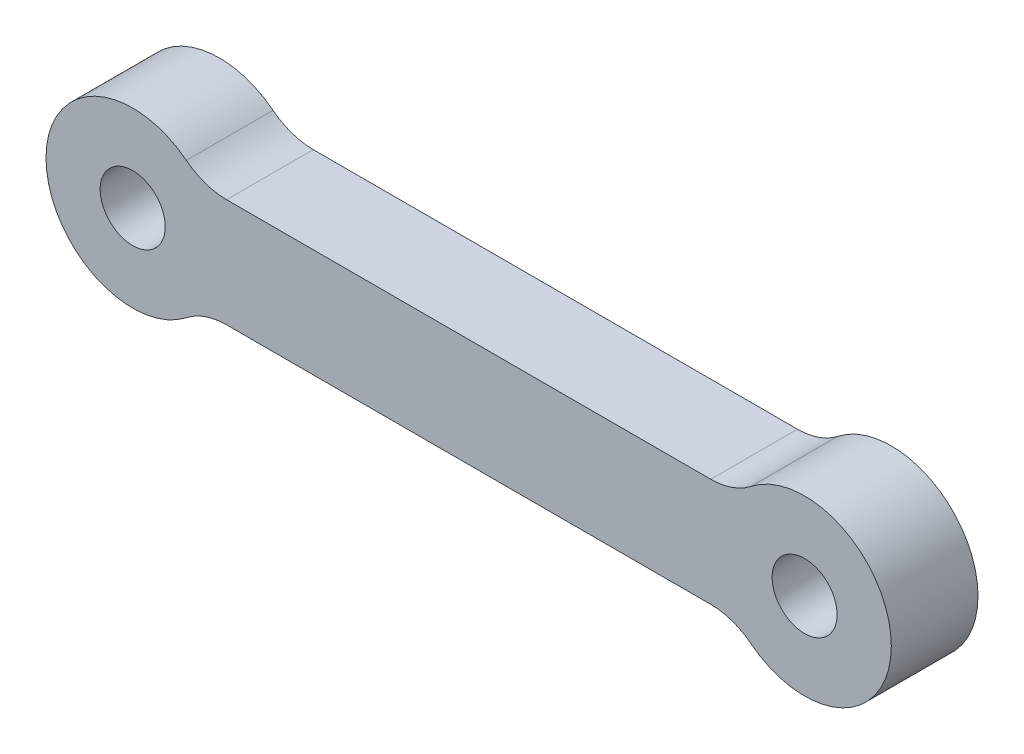
ISO-10303-21;
HEADER;
FILE_DESCRIPTION(('STEP AP214'),'2;1');
FILE_NAME('part.step','',(''),(''),'','','');
FILE_SCHEMA(('AUTOMOTIVE_DESIGN { 1 0 10303 214 1 1 1 1 }'));
ENDSEC;
DATA;
#1=APPLICATION_CONTEXT('core data for automotive mechanical design processes');
#2=APPLICATION_PROTOCOL_DEFINITION('international standard','automotive_design',2000,#1);
#3=PRODUCT_CONTEXT('',#1,'mechanical');
#4=PRODUCT('Part','Part','',(#3));
#5=PRODUCT_RELATED_PRODUCT_CATEGORY('part','',(#4));
#6=PRODUCT_DEFINITION_FORMATION('','',#4);
#7=PRODUCT_DEFINITION_CONTEXT('part definition',#1,'design');
#8=PRODUCT_DEFINITION('design','',#6,#7);
#9=PRODUCT_DEFINITION_SHAPE('','',#8);
#10=(LENGTH_UNIT() NAMED_UNIT(*) SI_UNIT(.MILLI.,.METRE.));
#11=(NAMED_UNIT(*) PLANE_ANGLE_UNIT() SI_UNIT($,.RADIAN.));
#12=(NAMED_UNIT(*) SI_UNIT($,.STERADIAN.) SOLID_ANGLE_UNIT());
#13=UNCERTAINTY_MEASURE_WITH_UNIT(LENGTH_MEASURE(1.E-05),#10,'distance_accuracy_value','');
#14=(GEOMETRIC_REPRESENTATION_CONTEXT(3) GLOBAL_UNCERTAINTY_ASSIGNED_CONTEXT((#13)) GLOBAL_UNIT_ASSIGNED_CONTEXT((#10,
#11,#12)) REPRESENTATION_CONTEXT('',''));
#15=CARTESIAN_POINT('',(0.,0.,0.));
#16=DIRECTION('',(0.,0.,1.));
#17=DIRECTION('',(1.,0.,0.));
#18=AXIS2_PLACEMENT_3D('',#15,#16,#17);
#19=CARTESIAN_POINT('',(11.1698729810778,-5.5,4.));
#20=DIRECTION('',(0.,0.,-1.));
#21=DIRECTION('',(-1.,0.,0.));
#22=AXIS2_PLACEMENT_3D('',#19,#20,#21);
#23=PLANE('',#22);
#24=CARTESIAN_POINT('',(11.1698729810778,-5.5,4.));
#25=DIRECTION('',(0.,0.,-1.));
#26=DIRECTION('',(-1.,0.,0.));
#27=AXIS2_PLACEMENT_3D('',#24,#25,#26);
#28=CIRCLE('',#27,3.);
#29=CARTESIAN_POINT('',(11.1698729810778,-2.5,4.));
#30=VERTEX_POINT('',#29);
#31=CARTESIAN_POINT('',(13.025641703473,-3.14285714285715,4.));
#32=VERTEX_POINT('',#31);
#33=EDGE_CURVE('E148',#30,#32,#28,.T.);
#34=ORIENTED_EDGE('',*,*,#33,.T.);
#35=CARTESIAN_POINT('',(15.5,0.,4.));
#36=DIRECTION('',(0.,0.,1.));
#37=DIRECTION('',(-1.,0.,0.));
#38=AXIS2_PLACEMENT_3D('',#35,#36,#37);
#39=CIRCLE('',#38,4.00000000000003);
#40=CARTESIAN_POINT('',(13.025641703473,3.14285714285715,4.));
#41=VERTEX_POINT('',#40);
#42=EDGE_CURVE('E96',#32,#41,#39,.T.);
#43=ORIENTED_EDGE('',*,*,#42,.T.);
#44=CARTESIAN_POINT('',(11.1698729810778,5.5,4.));
#45=DIRECTION('',(0.,0.,-1.));
#46=DIRECTION('',(-1.,0.,0.));
#47=AXIS2_PLACEMENT_3D('',#44,#45,#46);
#48=CIRCLE('',#47,3.);
#49=CARTESIAN_POINT('',(11.1698729810778,2.5,4.));
#50=VERTEX_POINT('',#49);
#51=EDGE_CURVE('E163',#41,#50,#48,.T.);
#52=ORIENTED_EDGE('',*,*,#51,.T.);
#53=DIRECTION('',(-1.,0.,0.));
#54=VECTOR('',#53,1.);
#55=CARTESIAN_POINT('',(11.1698729810778,2.5,4.));
#56=LINE('',#55,#54);
#57=CARTESIAN_POINT('',(-11.1698729810778,2.5,4.));
#58=VERTEX_POINT('',#57);
#59=EDGE_CURVE('E176',#50,#58,#56,.T.);
#60=ORIENTED_EDGE('',*,*,#59,.T.);
#61=CARTESIAN_POINT('',(-11.1698729810778,5.5,4.));
#62=DIRECTION('',(0.,0.,-1.));
#63=DIRECTION('',(-1.,0.,0.));
#64=AXIS2_PLACEMENT_3D('',#61,#62,#63);
#65=CIRCLE('',#64,3.);
#66=CARTESIAN_POINT('',(-13.025641703473,3.14285714285715,4.));
#67=VERTEX_POINT('',#66);
#68=EDGE_CURVE('E115',#58,#67,#65,.T.);
#69=ORIENTED_EDGE('',*,*,#68,.T.);
#70=CARTESIAN_POINT('',(-15.5,0.,4.));
#71=DIRECTION('',(0.,0.,1.));
#72=DIRECTION('',(1.,0.,0.));
#73=AXIS2_PLACEMENT_3D('',#70,#71,#72);
#74=CIRCLE('',#73,4.00000000000003);
#75=CARTESIAN_POINT('',(-13.025641703473,-3.14285714285715,4.));
#76=VERTEX_POINT('',#75);
#77=EDGE_CURVE('E109',#67,#76,#74,.T.);
#78=ORIENTED_EDGE('',*,*,#77,.T.);
#79=CARTESIAN_POINT('',(-11.1698729810778,-5.5,4.));
#80=DIRECTION('',(0.,0.,-1.));
#81=DIRECTION('',(1.,0.,0.));
#82=AXIS2_PLACEMENT_3D('',#79,#80,#81);
#83=CIRCLE('',#82,3.);
#84=CARTESIAN_POINT('',(-11.1698729810778,-2.5,4.));
#85=VERTEX_POINT('',#84);
#86=EDGE_CURVE('E113',#76,#85,#83,.T.);
#87=ORIENTED_EDGE('',*,*,#86,.T.);
#88=DIRECTION('',(1.,0.,0.));
#89=VECTOR('',#88,1.);
#90=CARTESIAN_POINT('',(11.1698729810778,-2.5,4.));
#91=LINE('',#90,#89);
#92=EDGE_CURVE('E53',#85,#30,#91,.T.);
#93=ORIENTED_EDGE('',*,*,#92,.T.);
#94=EDGE_LOOP('',(#34,#43,#52,#60,#69,#78,#87,#93));
#95=FACE_BOUND('',#94,.T.);
#96=CARTESIAN_POINT('',(-15.5,0.,4.));
#97=DIRECTION('',(0.,0.,1.));
#98=DIRECTION('',(1.,0.,0.));
#99=AXIS2_PLACEMENT_3D('',#96,#97,#98);
#100=CIRCLE('',#99,1.5);
#101=CARTESIAN_POINT('',(-14.,0.,4.));
#102=VERTEX_POINT('',#101);
#103=EDGE_CURVE('E137',#102,#102,#100,.T.);
#104=ORIENTED_EDGE('',*,*,#103,.F.);
#105=EDGE_LOOP('',(#104));
#106=FACE_BOUND('',#105,.T.);
#107=CARTESIAN_POINT('',(15.5,0.,4.));
#108=DIRECTION('',(0.,0.,1.));
#109=DIRECTION('',(-1.,0.,0.));
#110=AXIS2_PLACEMENT_3D('',#107,#108,#109);
#111=CIRCLE('',#110,1.5);
#112=CARTESIAN_POINT('',(14.,0.,4.));
#113=VERTEX_POINT('',#112);
#114=EDGE_CURVE('E185',#113,#113,#111,.T.);
#115=ORIENTED_EDGE('',*,*,#114,.F.);
#116=EDGE_LOOP('',(#115));
#117=FACE_BOUND('',#116,.T.);
#118=ADVANCED_FACE('F36',(#95,#106,#117),#23,.F.);
#119=CARTESIAN_POINT('',(11.1698729810778,-5.5,0.));
#120=DIRECTION('',(0.,0.,-1.));
#121=DIRECTION('',(-1.,0.,0.));
#122=AXIS2_PLACEMENT_3D('',#119,#120,#121);
#123=PLANE('',#122);
#124=CARTESIAN_POINT('',(-15.5,0.,0.));
#125=DIRECTION('',(0.,0.,1.));
#126=DIRECTION('',(1.,0.,0.));
#127=AXIS2_PLACEMENT_3D('',#124,#125,#126);
#128=CIRCLE('',#127,1.5);
#129=CARTESIAN_POINT('',(-14.,0.,0.));
#130=VERTEX_POINT('',#129);
#131=EDGE_CURVE('E182',#130,#130,#128,.T.);
#132=ORIENTED_EDGE('',*,*,#131,.T.);
#133=EDGE_LOOP('',(#132));
#134=FACE_BOUND('',#133,.T.);
#135=CARTESIAN_POINT('',(11.1698729810778,-5.5,0.));
#136=DIRECTION('',(0.,0.,-1.));
#137=DIRECTION('',(-1.,0.,0.));
#138=AXIS2_PLACEMENT_3D('',#135,#136,#137);
#139=CIRCLE('',#138,3.);
#140=CARTESIAN_POINT('',(11.1698729810778,-2.5,0.));
#141=VERTEX_POINT('',#140);
#142=CARTESIAN_POINT('',(13.025641703473,-3.14285714285715,0.));
#143=VERTEX_POINT('',#142);
#144=EDGE_CURVE('E133',#141,#143,#139,.T.);
#145=ORIENTED_EDGE('',*,*,#144,.F.);
#146=DIRECTION('',(1.,0.,0.));
#147=VECTOR('',#146,1.);
#148=CARTESIAN_POINT('',(11.1698729810778,-2.5,0.));
#149=LINE('',#148,#147);
#150=CARTESIAN_POINT('',(-11.1698729810778,-2.5,0.));
#151=VERTEX_POINT('',#150);
#152=EDGE_CURVE('E88',#151,#141,#149,.T.);
#153=ORIENTED_EDGE('',*,*,#152,.F.);
#154=CARTESIAN_POINT('',(-11.1698729810778,-5.5,0.));
#155=DIRECTION('',(0.,0.,-1.));
#156=DIRECTION('',(1.,0.,0.));
#157=AXIS2_PLACEMENT_3D('',#154,#155,#156);
#158=CIRCLE('',#157,3.);
#159=CARTESIAN_POINT('',(-13.025641703473,-3.14285714285715,0.));
#160=VERTEX_POINT('',#159);
#161=EDGE_CURVE('E82',#160,#151,#158,.T.);
#162=ORIENTED_EDGE('',*,*,#161,.F.);
#163=CARTESIAN_POINT('',(-15.5,0.,0.));
#164=DIRECTION('',(0.,0.,1.));
#165=DIRECTION('',(1.,0.,0.));
#166=AXIS2_PLACEMENT_3D('',#163,#164,#165);
#167=CIRCLE('',#166,4.00000000000003);
#168=CARTESIAN_POINT('',(-13.025641703473,3.14285714285715,0.));
#169=VERTEX_POINT('',#168);
#170=EDGE_CURVE('E123',#169,#160,#167,.T.);
#171=ORIENTED_EDGE('',*,*,#170,.F.);
#172=CARTESIAN_POINT('',(-11.1698729810778,5.5,0.));
#173=DIRECTION('',(0.,0.,-1.));
#174=DIRECTION('',(-1.,0.,0.));
#175=AXIS2_PLACEMENT_3D('',#172,#173,#174);
#176=CIRCLE('',#175,3.);
#177=CARTESIAN_POINT('',(-11.1698729810778,2.5,0.));
#178=VERTEX_POINT('',#177);
#179=EDGE_CURVE('E143',#178,#169,#176,.T.);
#180=ORIENTED_EDGE('',*,*,#179,.F.);
#181=DIRECTION('',(-1.,0.,0.));
#182=VECTOR('',#181,1.);
#183=CARTESIAN_POINT('',(11.1698729810778,2.5,0.));
#184=LINE('',#183,#182);
#185=CARTESIAN_POINT('',(11.1698729810778,2.5,0.));
#186=VERTEX_POINT('',#185);
#187=EDGE_CURVE('E141',#186,#178,#184,.T.);
#188=ORIENTED_EDGE('',*,*,#187,.F.);
#189=CARTESIAN_POINT('',(11.1698729810778,5.5,0.));
#190=DIRECTION('',(0.,0.,-1.));
#191=DIRECTION('',(-1.,0.,0.));
#192=AXIS2_PLACEMENT_3D('',#189,#190,#191);
#193=CIRCLE('',#192,3.);
#194=CARTESIAN_POINT('',(13.025641703473,3.14285714285715,0.));
#195=VERTEX_POINT('',#194);
#196=EDGE_CURVE('E139',#195,#186,#193,.T.);
#197=ORIENTED_EDGE('',*,*,#196,.F.);
#198=CARTESIAN_POINT('',(15.5,0.,0.));
#199=DIRECTION('',(0.,0.,1.));
#200=DIRECTION('',(-1.,0.,0.));
#201=AXIS2_PLACEMENT_3D('',#198,#199,#200);
#202=CIRCLE('',#201,4.00000000000003);
#203=EDGE_CURVE('E136',#143,#195,#202,.T.);
#204=ORIENTED_EDGE('',*,*,#203,.F.);
#205=EDGE_LOOP('',(#145,#153,#162,#171,#180,#188,#197,#204));
#206=FACE_BOUND('',#205,.T.);
#207=CARTESIAN_POINT('',(15.5,0.,0.));
#208=DIRECTION('',(0.,0.,1.));
#209=DIRECTION('',(-1.,0.,0.));
#210=AXIS2_PLACEMENT_3D('',#207,#208,#209);
#211=CIRCLE('',#210,1.5);
#212=CARTESIAN_POINT('',(14.,0.,0.));
#213=VERTEX_POINT('',#212);
#214=EDGE_CURVE('E188',#213,#213,#211,.T.);
#215=ORIENTED_EDGE('',*,*,#214,.T.);
#216=EDGE_LOOP('',(#215));
#217=FACE_BOUND('',#216,.T.);
#218=ADVANCED_FACE('F167',(#134,#206,#217),#123,.T.);
#219=CARTESIAN_POINT('',(11.1698729810778,-5.5,4.));
#220=DIRECTION('',(0.,0.,-1.));
#221=DIRECTION('',(-1.,0.,0.));
#222=AXIS2_PLACEMENT_3D('',#219,#220,#221);
#223=CYLINDRICAL_SURFACE('',#222,3.);
#224=ORIENTED_EDGE('',*,*,#144,.T.);
#225=DIRECTION('',(0.,0.,-1.));
#226=VECTOR('',#225,1.);
#227=CARTESIAN_POINT('',(13.025641703473,-3.14285714285715,4.));
#228=LINE('',#227,#226);
#229=EDGE_CURVE('E11',#32,#143,#228,.T.);
#230=ORIENTED_EDGE('',*,*,#229,.F.);
#231=ORIENTED_EDGE('',*,*,#33,.F.);
#232=DIRECTION('',(0.,0.,-1.));
#233=VECTOR('',#232,1.);
#234=CARTESIAN_POINT('',(11.1698729810778,-2.5,4.));
#235=LINE('',#234,#233);
#236=EDGE_CURVE('E129',#30,#141,#235,.T.);
#237=ORIENTED_EDGE('',*,*,#236,.T.);
#238=EDGE_LOOP('',(#224,#230,#231,#237));
#239=FACE_BOUND('',#238,.T.);
#240=ADVANCED_FACE('F38',(#239),#223,.F.);
#241=CARTESIAN_POINT('',(15.5,0.,4.));
#242=DIRECTION('',(0.,0.,-1.));
#243=DIRECTION('',(-1.,0.,0.));
#244=AXIS2_PLACEMENT_3D('',#241,#242,#243);
#245=CYLINDRICAL_SURFACE('',#244,4.00000000000003);
#246=ORIENTED_EDGE('',*,*,#203,.T.);
#247=DIRECTION('',(0.,0.,-1.));
#248=VECTOR('',#247,1.);
#249=CARTESIAN_POINT('',(13.025641703473,3.14285714285715,4.));
#250=LINE('',#249,#248);
#251=EDGE_CURVE('E45',#41,#195,#250,.T.);
#252=ORIENTED_EDGE('',*,*,#251,.F.);
#253=ORIENTED_EDGE('',*,*,#42,.F.);
#254=ORIENTED_EDGE('',*,*,#229,.T.);
#255=EDGE_LOOP('',(#246,#252,#253,#254));
#256=FACE_BOUND('',#255,.T.);
#257=ADVANCED_FACE('F220',(#256),#245,.T.);
#258=CARTESIAN_POINT('',(11.1698729810778,5.5,4.));
#259=DIRECTION('',(0.,0.,-1.));
#260=DIRECTION('',(-1.,0.,0.));
#261=AXIS2_PLACEMENT_3D('',#258,#259,#260);
#262=CYLINDRICAL_SURFACE('',#261,3.);
#263=ORIENTED_EDGE('',*,*,#196,.T.);
#264=DIRECTION('',(0.,0.,-1.));
#265=VECTOR('',#264,1.);
#266=CARTESIAN_POINT('',(11.1698729810778,2.5,4.));
#267=LINE('',#266,#265);
#268=EDGE_CURVE('E155',#50,#186,#267,.T.);
#269=ORIENTED_EDGE('',*,*,#268,.F.);
#270=ORIENTED_EDGE('',*,*,#51,.F.);
#271=ORIENTED_EDGE('',*,*,#251,.T.);
#272=EDGE_LOOP('',(#263,#269,#270,#271));
#273=FACE_BOUND('',#272,.T.);
#274=ADVANCED_FACE('F161',(#273),#262,.F.);
#275=CARTESIAN_POINT('',(11.1698729810778,2.5,4.));
#276=DIRECTION('',(0.,-1.,0.));
#277=DIRECTION('',(0.,0.,-1.));
#278=AXIS2_PLACEMENT_3D('',#275,#276,#277);
#279=PLANE('',#278);
#280=ORIENTED_EDGE('',*,*,#187,.T.);
#281=DIRECTION('',(0.,0.,-1.));
#282=VECTOR('',#281,1.);
#283=CARTESIAN_POINT('',(-11.1698729810778,2.5,4.));
#284=LINE('',#283,#282);
#285=EDGE_CURVE('E152',#58,#178,#284,.T.);
#286=ORIENTED_EDGE('',*,*,#285,.F.);
#287=ORIENTED_EDGE('',*,*,#59,.F.);
#288=ORIENTED_EDGE('',*,*,#268,.T.);
#289=EDGE_LOOP('',(#280,#286,#287,#288));
#290=FACE_BOUND('',#289,.T.);
#291=ADVANCED_FACE('F172',(#290),#279,.F.);
#292=CARTESIAN_POINT('',(-11.1698729810778,5.5,4.));
#293=DIRECTION('',(0.,0.,-1.));
#294=DIRECTION('',(-1.,0.,0.));
#295=AXIS2_PLACEMENT_3D('',#292,#293,#294);
#296=CYLINDRICAL_SURFACE('',#295,3.);
#297=ORIENTED_EDGE('',*,*,#179,.T.);
#298=DIRECTION('',(0.,0.,-1.));
#299=VECTOR('',#298,1.);
#300=CARTESIAN_POINT('',(-13.025641703473,3.14285714285715,4.));
#301=LINE('',#300,#299);
#302=EDGE_CURVE('E124',#67,#169,#301,.T.);
#303=ORIENTED_EDGE('',*,*,#302,.F.);
#304=ORIENTED_EDGE('',*,*,#68,.F.);
#305=ORIENTED_EDGE('',*,*,#285,.T.);
#306=EDGE_LOOP('',(#297,#303,#304,#305));
#307=FACE_BOUND('',#306,.T.);
#308=ADVANCED_FACE('F175',(#307),#296,.F.);
#309=CARTESIAN_POINT('',(-15.5,0.,4.));
#310=DIRECTION('',(0.,0.,-1.));
#311=DIRECTION('',(-1.,0.,0.));
#312=AXIS2_PLACEMENT_3D('',#309,#310,#311);
#313=CYLINDRICAL_SURFACE('',#312,4.00000000000003);
#314=ORIENTED_EDGE('',*,*,#170,.T.);
#315=DIRECTION('',(0.,0.,-1.));
#316=VECTOR('',#315,1.);
#317=CARTESIAN_POINT('',(-13.025641703473,-3.14285714285715,4.));
#318=LINE('',#317,#316);
#319=EDGE_CURVE('E120',#76,#160,#318,.T.);
#320=ORIENTED_EDGE('',*,*,#319,.F.);
#321=ORIENTED_EDGE('',*,*,#77,.F.);
#322=ORIENTED_EDGE('',*,*,#302,.T.);
#323=EDGE_LOOP('',(#314,#320,#321,#322));
#324=FACE_BOUND('',#323,.T.);
#325=ADVANCED_FACE('F121',(#324),#313,.T.);
#326=CARTESIAN_POINT('',(-11.1698729810778,-5.5,4.));
#327=DIRECTION('',(0.,0.,-1.));
#328=DIRECTION('',(-1.,0.,0.));
#329=AXIS2_PLACEMENT_3D('',#326,#327,#328);
#330=CYLINDRICAL_SURFACE('',#329,3.);
#331=ORIENTED_EDGE('',*,*,#161,.T.);
#332=DIRECTION('',(0.,0.,-1.));
#333=VECTOR('',#332,1.);
#334=CARTESIAN_POINT('',(-11.1698729810778,-2.5,4.));
#335=LINE('',#334,#333);
#336=EDGE_CURVE('E125',#85,#151,#335,.T.);
#337=ORIENTED_EDGE('',*,*,#336,.F.);
#338=ORIENTED_EDGE('',*,*,#86,.F.);
#339=ORIENTED_EDGE('',*,*,#319,.T.);
#340=EDGE_LOOP('',(#331,#337,#338,#339));
#341=FACE_BOUND('',#340,.T.);
#342=ADVANCED_FACE('F127',(#341),#330,.F.);
#343=CARTESIAN_POINT('',(11.1698729810778,-2.5,4.));
#344=DIRECTION('',(0.,1.,0.));
#345=DIRECTION('',(0.,0.,1.));
#346=AXIS2_PLACEMENT_3D('',#343,#344,#345);
#347=PLANE('',#346);
#348=ORIENTED_EDGE('',*,*,#152,.T.);
#349=ORIENTED_EDGE('',*,*,#236,.F.);
#350=ORIENTED_EDGE('',*,*,#92,.F.);
#351=ORIENTED_EDGE('',*,*,#336,.T.);
#352=EDGE_LOOP('',(#348,#349,#350,#351));
#353=FACE_BOUND('',#352,.T.);
#354=ADVANCED_FACE('F208',(#353),#347,.F.);
#355=CARTESIAN_POINT('',(-15.5,0.,4.));
#356=DIRECTION('',(0.,0.,-1.));
#357=DIRECTION('',(-1.,0.,0.));
#358=AXIS2_PLACEMENT_3D('',#355,#356,#357);
#359=CYLINDRICAL_SURFACE('',#358,1.5);
#360=ORIENTED_EDGE('',*,*,#103,.T.);
#361=EDGE_LOOP('',(#360));
#362=FACE_BOUND('',#361,.T.);
#363=ORIENTED_EDGE('',*,*,#131,.F.);
#364=EDGE_LOOP('',(#363));
#365=FACE_BOUND('',#364,.T.);
#366=ADVANCED_FACE('F205',(#362,#365),#359,.F.);
#367=CARTESIAN_POINT('',(15.5,0.,4.));
#368=DIRECTION('',(0.,0.,-1.));
#369=DIRECTION('',(-1.,0.,0.));
#370=AXIS2_PLACEMENT_3D('',#367,#368,#369);
#371=CYLINDRICAL_SURFACE('',#370,1.5);
#372=ORIENTED_EDGE('',*,*,#114,.T.);
#373=EDGE_LOOP('',(#372));
#374=FACE_BOUND('',#373,.T.);
#375=ORIENTED_EDGE('',*,*,#214,.F.);
#376=EDGE_LOOP('',(#375));
#377=FACE_BOUND('',#376,.T.);
#378=ADVANCED_FACE('F194',(#374,#377),#371,.F.);
#379=CLOSED_SHELL('',(#118,#218,#240,#257,#274,#291,#308,#325,#342,#354,#366,#378));
#380=MANIFOLD_SOLID_BREP('B2',#379);
#381=ADVANCED_BREP_SHAPE_REPRESENTATION('',(#18,#380),#14);
#382=SHAPE_DEFINITION_REPRESENTATION(#9,#381);
ENDSEC;
END-ISO-10303-21;
